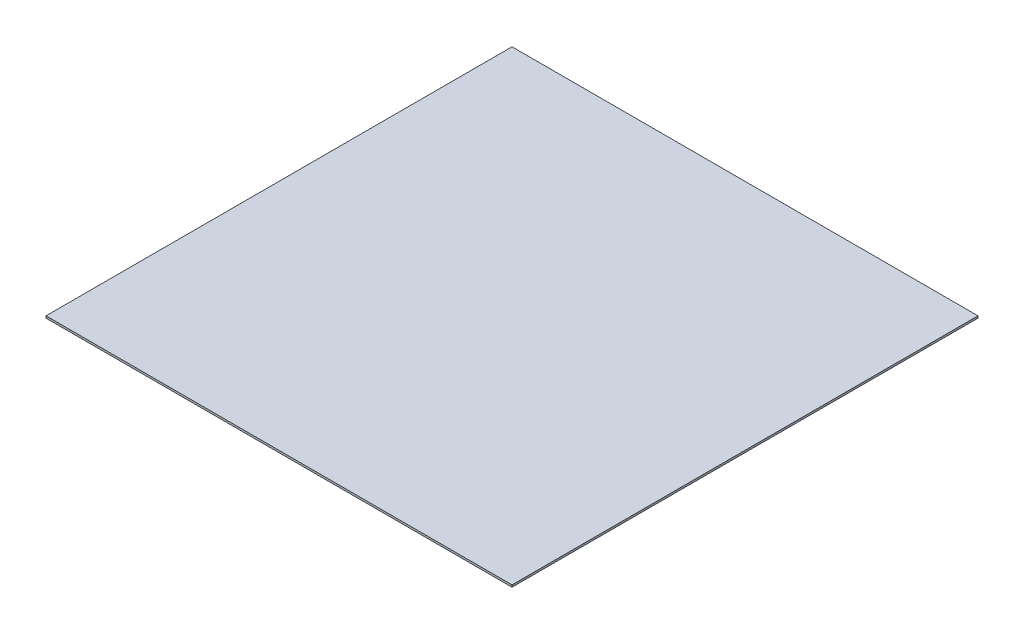
ISO-10303-21;
HEADER;
FILE_DESCRIPTION(('STEP AP214'),'2;1');
FILE_NAME('part.step','',(''),(''),'','','');
FILE_SCHEMA(('AUTOMOTIVE_DESIGN { 1 0 10303 214 1 1 1 1 }'));
ENDSEC;
DATA;
#1=APPLICATION_CONTEXT('core data for automotive mechanical design processes');
#2=APPLICATION_PROTOCOL_DEFINITION('international standard','automotive_design',2000,#1);
#3=PRODUCT_CONTEXT('',#1,'mechanical');
#4=PRODUCT('Part','Part','',(#3));
#5=PRODUCT_RELATED_PRODUCT_CATEGORY('part','',(#4));
#6=PRODUCT_DEFINITION_FORMATION('','',#4);
#7=PRODUCT_DEFINITION_CONTEXT('part definition',#1,'design');
#8=PRODUCT_DEFINITION('design','',#6,#7);
#9=PRODUCT_DEFINITION_SHAPE('','',#8);
#10=(LENGTH_UNIT() NAMED_UNIT(*) SI_UNIT(.MILLI.,.METRE.));
#11=(NAMED_UNIT(*) PLANE_ANGLE_UNIT() SI_UNIT($,.RADIAN.));
#12=(NAMED_UNIT(*) SI_UNIT($,.STERADIAN.) SOLID_ANGLE_UNIT());
#13=UNCERTAINTY_MEASURE_WITH_UNIT(LENGTH_MEASURE(1.E-05),#10,'distance_accuracy_value','');
#14=(GEOMETRIC_REPRESENTATION_CONTEXT(3) GLOBAL_UNCERTAINTY_ASSIGNED_CONTEXT((#13)) GLOBAL_UNIT_ASSIGNED_CONTEXT((#10,
#11,#12)) REPRESENTATION_CONTEXT('',''));
#15=CARTESIAN_POINT('',(0.,0.,0.));
#16=DIRECTION('',(0.,0.,1.));
#17=DIRECTION('',(1.,0.,0.));
#18=AXIS2_PLACEMENT_3D('',#15,#16,#17);
#19=CARTESIAN_POINT('',(150.,1.3,-150.));
#20=DIRECTION('',(-1.,0.,0.));
#21=DIRECTION('',(0.,0.,1.));
#22=AXIS2_PLACEMENT_3D('',#19,#20,#21);
#23=PLANE('',#22);
#24=DIRECTION('',(0.,0.,-1.));
#25=VECTOR('',#24,1.);
#26=CARTESIAN_POINT('',(150.,0.,-150.));
#27=LINE('',#26,#25);
#28=CARTESIAN_POINT('',(150.,0.,150.));
#29=VERTEX_POINT('',#28);
#30=CARTESIAN_POINT('',(150.,0.,-150.));
#31=VERTEX_POINT('',#30);
#32=EDGE_CURVE('E96',#29,#31,#27,.T.);
#33=ORIENTED_EDGE('',*,*,#32,.T.);
#34=DIRECTION('',(0.,-1.,0.));
#35=VECTOR('',#34,1.);
#36=CARTESIAN_POINT('',(150.,1.3,-150.));
#37=LINE('',#36,#35);
#38=CARTESIAN_POINT('',(150.,1.3,-150.));
#39=VERTEX_POINT('',#38);
#40=EDGE_CURVE('E11',#39,#31,#37,.T.);
#41=ORIENTED_EDGE('',*,*,#40,.F.);
#42=DIRECTION('',(0.,0.,-1.));
#43=VECTOR('',#42,1.);
#44=CARTESIAN_POINT('',(150.,1.3,-150.));
#45=LINE('',#44,#43);
#46=CARTESIAN_POINT('',(150.,1.3,150.));
#47=VERTEX_POINT('',#46);
#48=EDGE_CURVE('E84',#47,#39,#45,.T.);
#49=ORIENTED_EDGE('',*,*,#48,.F.);
#50=DIRECTION('',(0.,-1.,0.));
#51=VECTOR('',#50,1.);
#52=CARTESIAN_POINT('',(150.,1.3,150.));
#53=LINE('',#52,#51);
#54=EDGE_CURVE('E92',#47,#29,#53,.T.);
#55=ORIENTED_EDGE('',*,*,#54,.T.);
#56=EDGE_LOOP('',(#33,#41,#49,#55));
#57=FACE_BOUND('',#56,.T.);
#58=ADVANCED_FACE('F33',(#57),#23,.F.);
#59=CARTESIAN_POINT('',(-150.,1.3,-150.));
#60=DIRECTION('',(0.,0.,1.));
#61=DIRECTION('',(1.,0.,0.));
#62=AXIS2_PLACEMENT_3D('',#59,#60,#61);
#63=PLANE('',#62);
#64=DIRECTION('',(-1.,0.,0.));
#65=VECTOR('',#64,1.);
#66=CARTESIAN_POINT('',(-150.,0.,-150.));
#67=LINE('',#66,#65);
#68=CARTESIAN_POINT('',(-150.,0.,-150.));
#69=VERTEX_POINT('',#68);
#70=EDGE_CURVE('E88',#31,#69,#67,.T.);
#71=ORIENTED_EDGE('',*,*,#70,.T.);
#72=DIRECTION('',(0.,-1.,0.));
#73=VECTOR('',#72,1.);
#74=CARTESIAN_POINT('',(-150.,1.3,-150.));
#75=LINE('',#74,#73);
#76=CARTESIAN_POINT('',(-150.,1.3,-150.));
#77=VERTEX_POINT('',#76);
#78=EDGE_CURVE('E41',#77,#69,#75,.T.);
#79=ORIENTED_EDGE('',*,*,#78,.F.);
#80=DIRECTION('',(-1.,0.,0.));
#81=VECTOR('',#80,1.);
#82=CARTESIAN_POINT('',(-150.,1.3,-150.));
#83=LINE('',#82,#81);
#84=EDGE_CURVE('E79',#39,#77,#83,.T.);
#85=ORIENTED_EDGE('',*,*,#84,.F.);
#86=ORIENTED_EDGE('',*,*,#40,.T.);
#87=EDGE_LOOP('',(#71,#79,#85,#86));
#88=FACE_BOUND('',#87,.T.);
#89=ADVANCED_FACE('F87',(#88),#63,.F.);
#90=CARTESIAN_POINT('',(-150.,1.3,-150.));
#91=DIRECTION('',(1.,0.,0.));
#92=DIRECTION('',(0.,0.,-1.));
#93=AXIS2_PLACEMENT_3D('',#90,#91,#92);
#94=PLANE('',#93);
#95=DIRECTION('',(0.,0.,1.));
#96=VECTOR('',#95,1.);
#97=CARTESIAN_POINT('',(-150.,0.,-150.));
#98=LINE('',#97,#96);
#99=CARTESIAN_POINT('',(-150.,0.,150.));
#100=VERTEX_POINT('',#99);
#101=EDGE_CURVE('E66',#69,#100,#98,.T.);
#102=ORIENTED_EDGE('',*,*,#101,.T.);
#103=DIRECTION('',(0.,-1.,0.));
#104=VECTOR('',#103,1.);
#105=CARTESIAN_POINT('',(-150.,1.3,150.));
#106=LINE('',#105,#104);
#107=CARTESIAN_POINT('',(-150.,1.3,150.));
#108=VERTEX_POINT('',#107);
#109=EDGE_CURVE('E89',#108,#100,#106,.T.);
#110=ORIENTED_EDGE('',*,*,#109,.F.);
#111=DIRECTION('',(0.,0.,1.));
#112=VECTOR('',#111,1.);
#113=CARTESIAN_POINT('',(-150.,1.3,-150.));
#114=LINE('',#113,#112);
#115=EDGE_CURVE('E82',#77,#108,#114,.T.);
#116=ORIENTED_EDGE('',*,*,#115,.F.);
#117=ORIENTED_EDGE('',*,*,#78,.T.);
#118=EDGE_LOOP('',(#102,#110,#116,#117));
#119=FACE_BOUND('',#118,.T.);
#120=ADVANCED_FACE('F90',(#119),#94,.F.);
#121=CARTESIAN_POINT('',(-150.,1.3,150.));
#122=DIRECTION('',(0.,0.,-1.));
#123=DIRECTION('',(-1.,0.,0.));
#124=AXIS2_PLACEMENT_3D('',#121,#122,#123);
#125=PLANE('',#124);
#126=DIRECTION('',(1.,0.,0.));
#127=VECTOR('',#126,1.);
#128=CARTESIAN_POINT('',(-150.,0.,150.));
#129=LINE('',#128,#127);
#130=EDGE_CURVE('E72',#100,#29,#129,.T.);
#131=ORIENTED_EDGE('',*,*,#130,.T.);
#132=ORIENTED_EDGE('',*,*,#54,.F.);
#133=DIRECTION('',(1.,0.,0.));
#134=VECTOR('',#133,1.);
#135=CARTESIAN_POINT('',(-150.,1.3,150.));
#136=LINE('',#135,#134);
#137=EDGE_CURVE('E49',#108,#47,#136,.T.);
#138=ORIENTED_EDGE('',*,*,#137,.F.);
#139=ORIENTED_EDGE('',*,*,#109,.T.);
#140=EDGE_LOOP('',(#131,#132,#138,#139));
#141=FACE_BOUND('',#140,.T.);
#142=ADVANCED_FACE('F103',(#141),#125,.F.);
#143=CARTESIAN_POINT('',(0.,1.3,0.));
#144=DIRECTION('',(0.,1.,0.));
#145=DIRECTION('',(0.,0.,1.));
#146=AXIS2_PLACEMENT_3D('',#143,#144,#145);
#147=PLANE('',#146);
#148=ORIENTED_EDGE('',*,*,#48,.T.);
#149=ORIENTED_EDGE('',*,*,#84,.T.);
#150=ORIENTED_EDGE('',*,*,#115,.T.);
#151=ORIENTED_EDGE('',*,*,#137,.T.);
#152=EDGE_LOOP('',(#148,#149,#150,#151));
#153=FACE_BOUND('',#152,.T.);
#154=ADVANCED_FACE('F80',(#153),#147,.T.);
#155=CARTESIAN_POINT('',(0.,0.,0.));
#156=DIRECTION('',(0.,1.,0.));
#157=DIRECTION('',(0.,0.,1.));
#158=AXIS2_PLACEMENT_3D('',#155,#156,#157);
#159=PLANE('',#158);
#160=ORIENTED_EDGE('',*,*,#32,.F.);
#161=ORIENTED_EDGE('',*,*,#130,.F.);
#162=ORIENTED_EDGE('',*,*,#101,.F.);
#163=ORIENTED_EDGE('',*,*,#70,.F.);
#164=EDGE_LOOP('',(#160,#161,#162,#163));
#165=FACE_BOUND('',#164,.T.);
#166=ADVANCED_FACE('F106',(#165),#159,.F.);
#167=CLOSED_SHELL('',(#58,#89,#120,#142,#154,#166));
#168=MANIFOLD_SOLID_BREP('B2',#167);
#169=ADVANCED_BREP_SHAPE_REPRESENTATION('',(#18,#168),#14);
#170=SHAPE_DEFINITION_REPRESENTATION(#9,#169);
ENDSEC;
END-ISO-10303-21;
